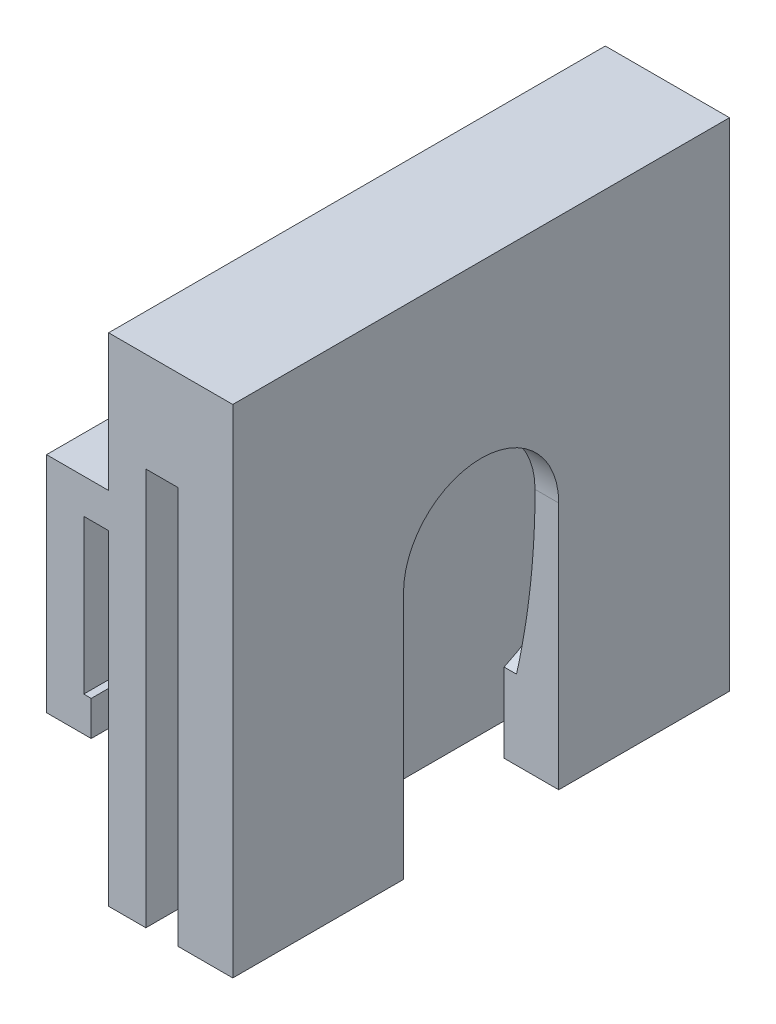
ISO-10303-21;
HEADER;
FILE_DESCRIPTION(('STEP AP214'),'2;1');
FILE_NAME('part.step','',(''),(''),'','','');
FILE_SCHEMA(('AUTOMOTIVE_DESIGN { 1 0 10303 214 1 1 1 1 }'));
ENDSEC;
DATA;
#1=APPLICATION_CONTEXT('core data for automotive mechanical design processes');
#2=APPLICATION_PROTOCOL_DEFINITION('international standard','automotive_design',2000,#1);
#3=PRODUCT_CONTEXT('',#1,'mechanical');
#4=PRODUCT('Part','Part','',(#3));
#5=PRODUCT_RELATED_PRODUCT_CATEGORY('part','',(#4));
#6=PRODUCT_DEFINITION_FORMATION('','',#4);
#7=PRODUCT_DEFINITION_CONTEXT('part definition',#1,'design');
#8=PRODUCT_DEFINITION('design','',#6,#7);
#9=PRODUCT_DEFINITION_SHAPE('','',#8);
#10=(LENGTH_UNIT() NAMED_UNIT(*) SI_UNIT(.MILLI.,.METRE.));
#11=(NAMED_UNIT(*) PLANE_ANGLE_UNIT() SI_UNIT($,.RADIAN.));
#12=(NAMED_UNIT(*) SI_UNIT($,.STERADIAN.) SOLID_ANGLE_UNIT());
#13=UNCERTAINTY_MEASURE_WITH_UNIT(LENGTH_MEASURE(1.E-05),#10,'distance_accuracy_value','');
#14=(GEOMETRIC_REPRESENTATION_CONTEXT(3) GLOBAL_UNCERTAINTY_ASSIGNED_CONTEXT((#13)) GLOBAL_UNIT_ASSIGNED_CONTEXT((#10,
#11,#12)) REPRESENTATION_CONTEXT('',''));
#15=CARTESIAN_POINT('',(0.,0.,0.));
#16=DIRECTION('',(0.,0.,1.));
#17=DIRECTION('',(1.,0.,0.));
#18=AXIS2_PLACEMENT_3D('',#15,#16,#17);
#19=CARTESIAN_POINT('',(-27.7842712474619,-10.,20.));
#20=DIRECTION('',(0.,-1.,0.));
#21=DIRECTION('',(0.,0.,-1.));
#22=AXIS2_PLACEMENT_3D('',#19,#20,#21);
#23=PLANE('',#22);
#24=DIRECTION('',(1.,0.,0.));
#25=VECTOR('',#24,1.);
#26=CARTESIAN_POINT('',(-13.6104853464801,-10.,6.875));
#27=LINE('',#26,#25);
#28=CARTESIAN_POINT('',(3.3,-10.,6.875));
#29=VERTEX_POINT('',#28);
#30=CARTESIAN_POINT('',(5.5,-10.,6.875));
#31=VERTEX_POINT('',#30);
#32=EDGE_CURVE('E274',#29,#31,#27,.T.);
#33=ORIENTED_EDGE('',*,*,#32,.F.);
#34=DIRECTION('',(0.,0.,1.));
#35=VECTOR('',#34,1.);
#36=CARTESIAN_POINT('',(3.3,-10.,0.));
#37=LINE('',#36,#35);
#38=CARTESIAN_POINT('',(3.3,-10.,0.));
#39=VERTEX_POINT('',#38);
#40=EDGE_CURVE('E236',#39,#29,#37,.T.);
#41=ORIENTED_EDGE('',*,*,#40,.F.);
#42=DIRECTION('',(1.,0.,0.));
#43=VECTOR('',#42,1.);
#44=CARTESIAN_POINT('',(-27.7842712474619,-10.,0.));
#45=LINE('',#44,#43);
#46=CARTESIAN_POINT('',(5.5,-10.,0.));
#47=VERTEX_POINT('',#46);
#48=EDGE_CURVE('E333',#39,#47,#45,.T.);
#49=ORIENTED_EDGE('',*,*,#48,.T.);
#50=DIRECTION('',(0.,0.,-1.));
#51=VECTOR('',#50,1.);
#52=CARTESIAN_POINT('',(5.5,-10.,20.));
#53=LINE('',#52,#51);
#54=EDGE_CURVE('E304',#31,#47,#53,.T.);
#55=ORIENTED_EDGE('',*,*,#54,.F.);
#56=EDGE_LOOP('',(#33,#41,#49,#55));
#57=FACE_BOUND('',#56,.T.);
#58=ADVANCED_FACE('F33',(#57),#23,.T.);
#59=DIRECTION('',(0.,0.,-1.));
#60=VECTOR('',#59,1.);
#61=CARTESIAN_POINT('',(2.,-10.,20.));
#62=LINE('',#61,#60);
#63=CARTESIAN_POINT('',(2.,-10.,20.));
#64=VERTEX_POINT('',#63);
#65=CARTESIAN_POINT('',(2.,-10.,0.));
#66=VERTEX_POINT('',#65);
#67=EDGE_CURVE('E273',#64,#66,#62,.T.);
#68=ORIENTED_EDGE('',*,*,#67,.F.);
#69=DIRECTION('',(1.,0.,0.));
#70=VECTOR('',#69,1.);
#71=CARTESIAN_POINT('',(-27.7842712474619,-10.,20.));
#72=LINE('',#71,#70);
#73=CARTESIAN_POINT('',(0.499999999999997,-10.,20.));
#74=VERTEX_POINT('',#73);
#75=EDGE_CURVE('E334',#74,#64,#72,.T.);
#76=ORIENTED_EDGE('',*,*,#75,.F.);
#77=DIRECTION('',(0.,0.,1.));
#78=VECTOR('',#77,1.);
#79=CARTESIAN_POINT('',(0.499999999999997,-10.,20.));
#80=LINE('',#79,#78);
#81=CARTESIAN_POINT('',(0.499999999999997,-10.,0.));
#82=VERTEX_POINT('',#81);
#83=EDGE_CURVE('E326',#82,#74,#80,.T.);
#84=ORIENTED_EDGE('',*,*,#83,.F.);
#85=EDGE_CURVE('E330',#82,#66,#45,.T.);
#86=ORIENTED_EDGE('',*,*,#85,.T.);
#87=EDGE_LOOP('',(#68,#76,#84,#86));
#88=FACE_BOUND('',#87,.T.);
#89=ADVANCED_FACE('F443',(#88),#23,.T.);
#90=CARTESIAN_POINT('',(2.,-4.5,20.));
#91=DIRECTION('',(0.,1.,0.));
#92=DIRECTION('',(-1.,0.,0.));
#93=AXIS2_PLACEMENT_3D('',#90,#91,#92);
#94=PLANE('',#93);
#95=DIRECTION('',(1.,0.,0.));
#96=VECTOR('',#95,1.);
#97=CARTESIAN_POINT('',(2.,-4.5,0.));
#98=LINE('',#97,#96);
#99=CARTESIAN_POINT('',(-2.,-4.5,0.));
#100=VERTEX_POINT('',#99);
#101=CARTESIAN_POINT('',(-0.2,-4.5,0.));
#102=VERTEX_POINT('',#101);
#103=EDGE_CURVE('E358',#100,#102,#98,.T.);
#104=ORIENTED_EDGE('',*,*,#103,.T.);
#105=DIRECTION('',(0.,0.,1.));
#106=VECTOR('',#105,1.);
#107=CARTESIAN_POINT('',(-0.2,-4.5,0.));
#108=LINE('',#107,#106);
#109=CARTESIAN_POINT('',(-0.2,-4.5,20.));
#110=VERTEX_POINT('',#109);
#111=EDGE_CURVE('E229',#102,#110,#108,.T.);
#112=ORIENTED_EDGE('',*,*,#111,.T.);
#113=DIRECTION('',(1.,0.,0.));
#114=VECTOR('',#113,1.);
#115=CARTESIAN_POINT('',(2.,-4.5,20.));
#116=LINE('',#115,#114);
#117=CARTESIAN_POINT('',(-2.,-4.5,20.));
#118=VERTEX_POINT('',#117);
#119=EDGE_CURVE('E349',#118,#110,#116,.T.);
#120=ORIENTED_EDGE('',*,*,#119,.F.);
#121=DIRECTION('',(0.,0.,-1.));
#122=VECTOR('',#121,1.);
#123=CARTESIAN_POINT('',(-2.,-4.5,20.));
#124=LINE('',#123,#122);
#125=EDGE_CURVE('E364',#118,#100,#124,.T.);
#126=ORIENTED_EDGE('',*,*,#125,.T.);
#127=EDGE_LOOP('',(#104,#112,#120,#126));
#128=FACE_BOUND('',#127,.T.);
#129=ADVANCED_FACE('F448',(#128),#94,.F.);
#130=CARTESIAN_POINT('',(2.,4.5,20.));
#131=DIRECTION('',(0.,-1.,0.));
#132=DIRECTION('',(1.,0.,0.));
#133=AXIS2_PLACEMENT_3D('',#130,#131,#132);
#134=PLANE('',#133);
#135=DIRECTION('',(0.,0.,1.));
#136=VECTOR('',#135,1.);
#137=CARTESIAN_POINT('',(0.500000000000001,4.5,20.));
#138=LINE('',#137,#136);
#139=CARTESIAN_POINT('',(0.5,4.5,0.));
#140=VERTEX_POINT('',#139);
#141=CARTESIAN_POINT('',(0.5,4.5,20.));
#142=VERTEX_POINT('',#141);
#143=EDGE_CURVE('E339',#140,#142,#138,.T.);
#144=ORIENTED_EDGE('',*,*,#143,.F.);
#145=DIRECTION('',(-1.,0.,0.));
#146=VECTOR('',#145,1.);
#147=CARTESIAN_POINT('',(2.,4.5,0.));
#148=LINE('',#147,#146);
#149=CARTESIAN_POINT('',(-2.,4.5,0.));
#150=VERTEX_POINT('',#149);
#151=EDGE_CURVE('E350',#140,#150,#148,.T.);
#152=ORIENTED_EDGE('',*,*,#151,.T.);
#153=DIRECTION('',(0.,0.,-1.));
#154=VECTOR('',#153,1.);
#155=CARTESIAN_POINT('',(-2.,4.5,20.));
#156=LINE('',#155,#154);
#157=CARTESIAN_POINT('',(-2.,4.5,20.));
#158=VERTEX_POINT('',#157);
#159=EDGE_CURVE('E355',#158,#150,#156,.T.);
#160=ORIENTED_EDGE('',*,*,#159,.F.);
#161=DIRECTION('',(-1.,0.,0.));
#162=VECTOR('',#161,1.);
#163=CARTESIAN_POINT('',(2.,4.5,20.));
#164=LINE('',#163,#162);
#165=EDGE_CURVE('E353',#142,#158,#164,.T.);
#166=ORIENTED_EDGE('',*,*,#165,.F.);
#167=EDGE_LOOP('',(#144,#152,#160,#166));
#168=FACE_BOUND('',#167,.T.);
#169=ADVANCED_FACE('F573',(#168),#134,.F.);
#170=CARTESIAN_POINT('',(-2.,4.5,20.));
#171=DIRECTION('',(1.,0.,0.));
#172=DIRECTION('',(0.,1.,0.));
#173=AXIS2_PLACEMENT_3D('',#170,#171,#172);
#174=PLANE('',#173);
#175=DIRECTION('',(0.,-1.,0.));
#176=VECTOR('',#175,1.);
#177=CARTESIAN_POINT('',(-2.,4.5,0.));
#178=LINE('',#177,#176);
#179=EDGE_CURVE('E344',#150,#100,#178,.T.);
#180=ORIENTED_EDGE('',*,*,#179,.T.);
#181=ORIENTED_EDGE('',*,*,#125,.F.);
#182=DIRECTION('',(0.,-1.,0.));
#183=VECTOR('',#182,1.);
#184=CARTESIAN_POINT('',(-2.,4.5,20.));
#185=LINE('',#184,#183);
#186=EDGE_CURVE('E346',#158,#118,#185,.T.);
#187=ORIENTED_EDGE('',*,*,#186,.F.);
#188=ORIENTED_EDGE('',*,*,#159,.T.);
#189=EDGE_LOOP('',(#180,#181,#187,#188));
#190=FACE_BOUND('',#189,.T.);
#191=ADVANCED_FACE('F35',(#190),#174,.F.);
#192=CARTESIAN_POINT('',(0.,0.,20.));
#193=DIRECTION('',(0.,0.,-1.));
#194=DIRECTION('',(-1.,0.,0.));
#195=AXIS2_PLACEMENT_3D('',#192,#193,#194);
#196=PLANE('',#195);
#197=DIRECTION('',(0.,1.,0.));
#198=VECTOR('',#197,1.);
#199=CARTESIAN_POINT('',(-0.499999999999999,3.,20.));
#200=LINE('',#199,#198);
#201=CARTESIAN_POINT('',(-0.5,-3.1,20.));
#202=VERTEX_POINT('',#201);
#203=CARTESIAN_POINT('',(-0.5,3.1,20.));
#204=VERTEX_POINT('',#203);
#205=EDGE_CURVE('E211',#202,#204,#200,.T.);
#206=ORIENTED_EDGE('',*,*,#205,.T.);
#207=DIRECTION('',(-1.,0.,0.));
#208=VECTOR('',#207,1.);
#209=CARTESIAN_POINT('',(-0.5,3.1,20.));
#210=LINE('',#209,#208);
#211=CARTESIAN_POINT('',(0.500000000000001,3.1,20.));
#212=VERTEX_POINT('',#211);
#213=EDGE_CURVE('E215',#212,#204,#210,.T.);
#214=ORIENTED_EDGE('',*,*,#213,.F.);
#215=DIRECTION('',(0.,-1.,0.));
#216=VECTOR('',#215,1.);
#217=CARTESIAN_POINT('',(0.500000000000001,3.,20.));
#218=LINE('',#217,#216);
#219=EDGE_CURVE('E206',#212,#74,#218,.T.);
#220=ORIENTED_EDGE('',*,*,#219,.T.);
#221=ORIENTED_EDGE('',*,*,#75,.T.);
#222=DIRECTION('',(0.,-1.,0.));
#223=VECTOR('',#222,1.);
#224=CARTESIAN_POINT('',(2.,6.,20.));
#225=LINE('',#224,#223);
#226=CARTESIAN_POINT('',(2.,6.,20.));
#227=VERTEX_POINT('',#226);
#228=EDGE_CURVE('E291',#227,#64,#225,.T.);
#229=ORIENTED_EDGE('',*,*,#228,.F.);
#230=DIRECTION('',(-1.,0.,0.));
#231=VECTOR('',#230,1.);
#232=CARTESIAN_POINT('',(2.,6.,20.));
#233=LINE('',#232,#231);
#234=CARTESIAN_POINT('',(3.3,6.,20.));
#235=VERTEX_POINT('',#234);
#236=EDGE_CURVE('E287',#235,#227,#233,.T.);
#237=ORIENTED_EDGE('',*,*,#236,.F.);
#238=DIRECTION('',(0.,1.,0.));
#239=VECTOR('',#238,1.);
#240=CARTESIAN_POINT('',(3.3,-10.,20.));
#241=LINE('',#240,#239);
#242=CARTESIAN_POINT('',(3.3,-10.,20.));
#243=VERTEX_POINT('',#242);
#244=EDGE_CURVE('E256',#243,#235,#241,.T.);
#245=ORIENTED_EDGE('',*,*,#244,.F.);
#246=CARTESIAN_POINT('',(5.5,-10.,20.));
#247=VERTEX_POINT('',#246);
#248=EDGE_CURVE('E317',#243,#247,#72,.T.);
#249=ORIENTED_EDGE('',*,*,#248,.T.);
#250=DIRECTION('',(0.,-1.,0.));
#251=VECTOR('',#250,1.);
#252=CARTESIAN_POINT('',(5.5,10.,20.));
#253=LINE('',#252,#251);
#254=CARTESIAN_POINT('',(5.5,10.,20.));
#255=VERTEX_POINT('',#254);
#256=EDGE_CURVE('E314',#255,#247,#253,.T.);
#257=ORIENTED_EDGE('',*,*,#256,.F.);
#258=DIRECTION('',(1.,0.,0.));
#259=VECTOR('',#258,1.);
#260=CARTESIAN_POINT('',(-27.7842712474619,10.,20.));
#261=LINE('',#260,#259);
#262=CARTESIAN_POINT('',(0.5,10.,20.));
#263=VERTEX_POINT('',#262);
#264=EDGE_CURVE('E322',#263,#255,#261,.T.);
#265=ORIENTED_EDGE('',*,*,#264,.F.);
#266=DIRECTION('',(0.,1.,0.));
#267=VECTOR('',#266,1.);
#268=CARTESIAN_POINT('',(0.5,9.99999999999999,20.));
#269=LINE('',#268,#267);
#270=EDGE_CURVE('E324',#142,#263,#269,.T.);
#271=ORIENTED_EDGE('',*,*,#270,.F.);
#272=ORIENTED_EDGE('',*,*,#165,.T.);
#273=ORIENTED_EDGE('',*,*,#186,.T.);
#274=ORIENTED_EDGE('',*,*,#119,.T.);
#275=DIRECTION('',(0.,-1.,0.));
#276=VECTOR('',#275,1.);
#277=CARTESIAN_POINT('',(-0.2,-4.5,20.));
#278=LINE('',#277,#276);
#279=CARTESIAN_POINT('',(-0.2,-3.1,20.));
#280=VERTEX_POINT('',#279);
#281=EDGE_CURVE('E224',#280,#110,#278,.T.);
#282=ORIENTED_EDGE('',*,*,#281,.F.);
#283=DIRECTION('',(1.,0.,0.));
#284=VECTOR('',#283,1.);
#285=CARTESIAN_POINT('',(-0.5,-3.1,20.));
#286=LINE('',#285,#284);
#287=EDGE_CURVE('E48',#202,#280,#286,.T.);
#288=ORIENTED_EDGE('',*,*,#287,.F.);
#289=EDGE_LOOP('',(#206,#214,#220,#221,#229,#237,#245,#249,#257,#265,#271,#272,#273,#274,#282,#288));
#290=FACE_BOUND('',#289,.T.);
#291=ADVANCED_FACE('F414',(#290),#196,.F.);
#292=CARTESIAN_POINT('',(0.,0.,0.));
#293=DIRECTION('',(0.,0.,-1.));
#294=DIRECTION('',(-1.,0.,0.));
#295=AXIS2_PLACEMENT_3D('',#292,#293,#294);
#296=PLANE('',#295);
#297=DIRECTION('',(-1.,0.,0.));
#298=VECTOR('',#297,1.);
#299=CARTESIAN_POINT('',(-0.5,3.1,0.));
#300=LINE('',#299,#298);
#301=CARTESIAN_POINT('',(0.500000000000001,3.1,0.));
#302=VERTEX_POINT('',#301);
#303=CARTESIAN_POINT('',(-0.5,3.1,0.));
#304=VERTEX_POINT('',#303);
#305=EDGE_CURVE('E202',#302,#304,#300,.T.);
#306=ORIENTED_EDGE('',*,*,#305,.T.);
#307=DIRECTION('',(0.,1.,0.));
#308=VECTOR('',#307,1.);
#309=CARTESIAN_POINT('',(-0.499999999999999,3.,0.));
#310=LINE('',#309,#308);
#311=CARTESIAN_POINT('',(-0.5,-3.1,0.));
#312=VERTEX_POINT('',#311);
#313=EDGE_CURVE('E195',#312,#304,#310,.T.);
#314=ORIENTED_EDGE('',*,*,#313,.F.);
#315=DIRECTION('',(1.,0.,0.));
#316=VECTOR('',#315,1.);
#317=CARTESIAN_POINT('',(-0.5,-3.1,0.));
#318=LINE('',#317,#316);
#319=CARTESIAN_POINT('',(-0.2,-3.1,0.));
#320=VERTEX_POINT('',#319);
#321=EDGE_CURVE('E199',#312,#320,#318,.T.);
#322=ORIENTED_EDGE('',*,*,#321,.T.);
#323=DIRECTION('',(0.,-1.,0.));
#324=VECTOR('',#323,1.);
#325=CARTESIAN_POINT('',(-0.2,-4.5,0.));
#326=LINE('',#325,#324);
#327=EDGE_CURVE('E227',#320,#102,#326,.T.);
#328=ORIENTED_EDGE('',*,*,#327,.T.);
#329=ORIENTED_EDGE('',*,*,#103,.F.);
#330=ORIENTED_EDGE('',*,*,#179,.F.);
#331=ORIENTED_EDGE('',*,*,#151,.F.);
#332=DIRECTION('',(0.,-1.,0.));
#333=VECTOR('',#332,1.);
#334=CARTESIAN_POINT('',(0.5,9.99999999999999,0.));
#335=LINE('',#334,#333);
#336=CARTESIAN_POINT('',(0.5,10.,0.));
#337=VERTEX_POINT('',#336);
#338=EDGE_CURVE('E318',#337,#140,#335,.T.);
#339=ORIENTED_EDGE('',*,*,#338,.F.);
#340=DIRECTION('',(1.,0.,0.));
#341=VECTOR('',#340,1.);
#342=CARTESIAN_POINT('',(-27.7842712474619,10.,0.));
#343=LINE('',#342,#341);
#344=CARTESIAN_POINT('',(5.5,10.,0.));
#345=VERTEX_POINT('',#344);
#346=EDGE_CURVE('E328',#337,#345,#343,.T.);
#347=ORIENTED_EDGE('',*,*,#346,.T.);
#348=DIRECTION('',(0.,1.,0.));
#349=VECTOR('',#348,1.);
#350=CARTESIAN_POINT('',(5.5,-10.,0.));
#351=LINE('',#350,#349);
#352=EDGE_CURVE('E308',#47,#345,#351,.T.);
#353=ORIENTED_EDGE('',*,*,#352,.F.);
#354=ORIENTED_EDGE('',*,*,#48,.F.);
#355=DIRECTION('',(0.,-1.,0.));
#356=VECTOR('',#355,1.);
#357=CARTESIAN_POINT('',(3.3,6.,0.));
#358=LINE('',#357,#356);
#359=CARTESIAN_POINT('',(3.3,6.,0.));
#360=VERTEX_POINT('',#359);
#361=EDGE_CURVE('E233',#360,#39,#358,.T.);
#362=ORIENTED_EDGE('',*,*,#361,.F.);
#363=DIRECTION('',(1.,0.,0.));
#364=VECTOR('',#363,1.);
#365=CARTESIAN_POINT('',(2.,6.,0.));
#366=LINE('',#365,#364);
#367=CARTESIAN_POINT('',(2.,6.,0.));
#368=VERTEX_POINT('',#367);
#369=EDGE_CURVE('E283',#368,#360,#366,.T.);
#370=ORIENTED_EDGE('',*,*,#369,.F.);
#371=DIRECTION('',(0.,-1.,0.));
#372=VECTOR('',#371,1.);
#373=CARTESIAN_POINT('',(2.,6.,0.));
#374=LINE('',#373,#372);
#375=EDGE_CURVE('E289',#368,#66,#374,.T.);
#376=ORIENTED_EDGE('',*,*,#375,.T.);
#377=ORIENTED_EDGE('',*,*,#85,.F.);
#378=DIRECTION('',(0.,-1.,0.));
#379=VECTOR('',#378,1.);
#380=CARTESIAN_POINT('',(0.500000000000001,3.,0.));
#381=LINE('',#380,#379);
#382=EDGE_CURVE('E207',#302,#82,#381,.T.);
#383=ORIENTED_EDGE('',*,*,#382,.F.);
#384=EDGE_LOOP('',(#306,#314,#322,#328,#329,#330,#331,#339,#347,#353,#354,#362,#370,#376,#377,#383));
#385=FACE_BOUND('',#384,.T.);
#386=ADVANCED_FACE('F197',(#385),#296,.T.);
#387=CARTESIAN_POINT('',(0.500000000000001,3.,20.));
#388=DIRECTION('',(1.,0.,0.));
#389=DIRECTION('',(0.,1.,0.));
#390=AXIS2_PLACEMENT_3D('',#387,#388,#389);
#391=PLANE('',#390);
#392=ORIENTED_EDGE('',*,*,#83,.T.);
#393=ORIENTED_EDGE('',*,*,#219,.F.);
#394=DIRECTION('',(0.,0.,1.));
#395=VECTOR('',#394,1.);
#396=CARTESIAN_POINT('',(0.500000000000001,3.1,0.));
#397=LINE('',#396,#395);
#398=EDGE_CURVE('E212',#302,#212,#397,.T.);
#399=ORIENTED_EDGE('',*,*,#398,.F.);
#400=ORIENTED_EDGE('',*,*,#382,.T.);
#401=EDGE_LOOP('',(#392,#393,#399,#400));
#402=FACE_BOUND('',#401,.T.);
#403=ADVANCED_FACE('F461',(#402),#391,.F.);
#404=CARTESIAN_POINT('',(-0.499999999999999,3.,20.));
#405=DIRECTION('',(-1.,0.,0.));
#406=DIRECTION('',(0.,-1.,0.));
#407=AXIS2_PLACEMENT_3D('',#404,#405,#406);
#408=PLANE('',#407);
#409=ORIENTED_EDGE('',*,*,#313,.T.);
#410=DIRECTION('',(0.,0.,1.));
#411=VECTOR('',#410,1.);
#412=CARTESIAN_POINT('',(-0.5,3.1,0.));
#413=LINE('',#412,#411);
#414=EDGE_CURVE('E222',#304,#204,#413,.T.);
#415=ORIENTED_EDGE('',*,*,#414,.T.);
#416=ORIENTED_EDGE('',*,*,#205,.F.);
#417=DIRECTION('',(0.,0.,1.));
#418=VECTOR('',#417,1.);
#419=CARTESIAN_POINT('',(-0.5,-3.1,0.));
#420=LINE('',#419,#418);
#421=EDGE_CURVE('E209',#312,#202,#420,.T.);
#422=ORIENTED_EDGE('',*,*,#421,.F.);
#423=EDGE_LOOP('',(#409,#415,#416,#422));
#424=FACE_BOUND('',#423,.T.);
#425=ADVANCED_FACE('F210',(#424),#408,.F.);
#426=CARTESIAN_POINT('',(-27.7842712474619,10.,20.));
#427=DIRECTION('',(0.,1.,0.));
#428=DIRECTION('',(0.,0.,1.));
#429=AXIS2_PLACEMENT_3D('',#426,#427,#428);
#430=PLANE('',#429);
#431=DIRECTION('',(0.,0.,-1.));
#432=VECTOR('',#431,1.);
#433=CARTESIAN_POINT('',(0.5,10.,20.));
#434=LINE('',#433,#432);
#435=EDGE_CURVE('E321',#263,#337,#434,.T.);
#436=ORIENTED_EDGE('',*,*,#435,.F.);
#437=ORIENTED_EDGE('',*,*,#264,.T.);
#438=DIRECTION('',(0.,0.,1.));
#439=VECTOR('',#438,1.);
#440=CARTESIAN_POINT('',(5.5,10.,0.));
#441=LINE('',#440,#439);
#442=EDGE_CURVE('E311',#345,#255,#441,.T.);
#443=ORIENTED_EDGE('',*,*,#442,.F.);
#444=ORIENTED_EDGE('',*,*,#346,.F.);
#445=EDGE_LOOP('',(#436,#437,#443,#444));
#446=FACE_BOUND('',#445,.T.);
#447=ADVANCED_FACE('F410',(#446),#430,.T.);
#448=ORIENTED_EDGE('',*,*,#338,.T.);
#449=ORIENTED_EDGE('',*,*,#143,.T.);
#450=ORIENTED_EDGE('',*,*,#270,.T.);
#451=ORIENTED_EDGE('',*,*,#435,.T.);
#452=EDGE_LOOP('',(#448,#449,#450,#451));
#453=FACE_BOUND('',#452,.T.);
#454=ADVANCED_FACE('F453',(#453),#391,.F.);
#455=DIRECTION('',(1.,0.,0.));
#456=VECTOR('',#455,1.);
#457=CARTESIAN_POINT('',(-13.6104853464801,-10.,13.125));
#458=LINE('',#457,#456);
#459=CARTESIAN_POINT('',(3.3,-10.,13.125));
#460=VERTEX_POINT('',#459);
#461=CARTESIAN_POINT('',(5.5,-10.,13.125));
#462=VERTEX_POINT('',#461);
#463=EDGE_CURVE('E276',#460,#462,#458,.T.);
#464=ORIENTED_EDGE('',*,*,#463,.T.);
#465=EDGE_CURVE('E305',#247,#462,#53,.T.);
#466=ORIENTED_EDGE('',*,*,#465,.F.);
#467=ORIENTED_EDGE('',*,*,#248,.F.);
#468=DIRECTION('',(0.,0.,1.));
#469=VECTOR('',#468,1.);
#470=CARTESIAN_POINT('',(3.3,-10.,13.125));
#471=LINE('',#470,#469);
#472=EDGE_CURVE('E253',#460,#243,#471,.T.);
#473=ORIENTED_EDGE('',*,*,#472,.F.);
#474=EDGE_LOOP('',(#464,#466,#467,#473));
#475=FACE_BOUND('',#474,.T.);
#476=ADVANCED_FACE('F418',(#475),#23,.T.);
#477=CARTESIAN_POINT('',(5.5,0.,0.));
#478=DIRECTION('',(1.,0.,0.));
#479=DIRECTION('',(0.,0.,-1.));
#480=AXIS2_PLACEMENT_3D('',#477,#478,#479);
#481=PLANE('',#480);
#482=DIRECTION('',(0.,1.,0.));
#483=VECTOR('',#482,1.);
#484=CARTESIAN_POINT('',(5.5,0.,6.875));
#485=LINE('',#484,#483);
#486=CARTESIAN_POINT('',(5.5,0.,6.875));
#487=VERTEX_POINT('',#486);
#488=EDGE_CURVE('E267',#31,#487,#485,.T.);
#489=ORIENTED_EDGE('',*,*,#488,.F.);
#490=ORIENTED_EDGE('',*,*,#54,.T.);
#491=ORIENTED_EDGE('',*,*,#352,.T.);
#492=ORIENTED_EDGE('',*,*,#442,.T.);
#493=ORIENTED_EDGE('',*,*,#256,.T.);
#494=ORIENTED_EDGE('',*,*,#465,.T.);
#495=DIRECTION('',(0.,-1.,0.));
#496=VECTOR('',#495,1.);
#497=CARTESIAN_POINT('',(5.5,0.,13.125));
#498=LINE('',#497,#496);
#499=CARTESIAN_POINT('',(5.5,0.,13.125));
#500=VERTEX_POINT('',#499);
#501=EDGE_CURVE('E265',#500,#462,#498,.T.);
#502=ORIENTED_EDGE('',*,*,#501,.F.);
#503=CARTESIAN_POINT('',(5.5,0.,10.));
#504=DIRECTION('',(1.,0.,0.));
#505=DIRECTION('',(0.,0.,-1.));
#506=AXIS2_PLACEMENT_3D('',#503,#504,#505);
#507=CIRCLE('',#506,3.125);
#508=EDGE_CURVE('E262',#487,#500,#507,.T.);
#509=ORIENTED_EDGE('',*,*,#508,.F.);
#510=EDGE_LOOP('',(#489,#490,#491,#492,#493,#494,#502,#509));
#511=FACE_BOUND('',#510,.T.);
#512=ADVANCED_FACE('F402',(#511),#481,.T.);
#513=CARTESIAN_POINT('',(0.,6.,0.));
#514=DIRECTION('',(0.,-1.,0.));
#515=DIRECTION('',(0.,0.,-1.));
#516=AXIS2_PLACEMENT_3D('',#513,#514,#515);
#517=PLANE('',#516);
#518=DIRECTION('',(0.,0.,-1.));
#519=VECTOR('',#518,1.);
#520=CARTESIAN_POINT('',(3.3,6.,5.50000000000004));
#521=LINE('',#520,#519);
#522=CARTESIAN_POINT('',(3.3,6.,5.50000000000004));
#523=VERTEX_POINT('',#522);
#524=EDGE_CURVE('E243',#523,#360,#521,.T.);
#525=ORIENTED_EDGE('',*,*,#524,.F.);
#526=DIRECTION('',(1.,0.,0.));
#527=VECTOR('',#526,1.);
#528=CARTESIAN_POINT('',(88.99,6.,5.5));
#529=LINE('',#528,#527);
#530=CARTESIAN_POINT('',(2.,6.,5.5));
#531=VERTEX_POINT('',#530);
#532=EDGE_CURVE('E297',#531,#523,#529,.T.);
#533=ORIENTED_EDGE('',*,*,#532,.F.);
#534=DIRECTION('',(0.,0.,-1.));
#535=VECTOR('',#534,1.);
#536=CARTESIAN_POINT('',(2.,6.,20.));
#537=LINE('',#536,#535);
#538=EDGE_CURVE('E284',#531,#368,#537,.T.);
#539=ORIENTED_EDGE('',*,*,#538,.T.);
#540=ORIENTED_EDGE('',*,*,#369,.T.);
#541=EDGE_LOOP('',(#525,#533,#539,#540));
#542=FACE_BOUND('',#541,.T.);
#543=ADVANCED_FACE('F389',(#542),#517,.T.);
#544=DIRECTION('',(0.,0.,-1.));
#545=VECTOR('',#544,1.);
#546=CARTESIAN_POINT('',(3.3,6.,20.));
#547=LINE('',#546,#545);
#548=CARTESIAN_POINT('',(3.3,6.,14.5));
#549=VERTEX_POINT('',#548);
#550=EDGE_CURVE('E258',#235,#549,#547,.T.);
#551=ORIENTED_EDGE('',*,*,#550,.F.);
#552=ORIENTED_EDGE('',*,*,#236,.T.);
#553=CARTESIAN_POINT('',(2.,6.,14.5));
#554=VERTEX_POINT('',#553);
#555=EDGE_CURVE('E280',#227,#554,#537,.T.);
#556=ORIENTED_EDGE('',*,*,#555,.T.);
#557=DIRECTION('',(1.,0.,0.));
#558=VECTOR('',#557,1.);
#559=CARTESIAN_POINT('',(88.99,6.,14.5));
#560=LINE('',#559,#558);
#561=EDGE_CURVE('E293',#549,#554,#560,.F.);
#562=ORIENTED_EDGE('',*,*,#561,.F.);
#563=EDGE_LOOP('',(#551,#552,#556,#562));
#564=FACE_BOUND('',#563,.T.);
#565=ADVANCED_FACE('F634',(#564),#517,.T.);
#566=CARTESIAN_POINT('',(88.99,0.,10.));
#567=DIRECTION('',(1.,0.,0.));
#568=DIRECTION('',(0.,0.,-1.));
#569=AXIS2_PLACEMENT_3D('',#566,#567,#568);
#570=CYLINDRICAL_SURFACE('',#569,7.5);
#571=CARTESIAN_POINT('',(2.,0.,10.));
#572=DIRECTION('',(1.,0.,0.));
#573=DIRECTION('',(0.,0.,-1.));
#574=AXIS2_PLACEMENT_3D('',#571,#572,#573);
#575=CIRCLE('',#574,7.5);
#576=EDGE_CURVE('E300',#531,#554,#575,.T.);
#577=ORIENTED_EDGE('',*,*,#576,.F.);
#578=ORIENTED_EDGE('',*,*,#532,.T.);
#579=CARTESIAN_POINT('',(3.3,0.,10.));
#580=DIRECTION('',(1.,0.,0.));
#581=DIRECTION('',(0.,0.,1.));
#582=AXIS2_PLACEMENT_3D('',#579,#580,#581);
#583=CIRCLE('',#582,7.49999999999997);
#584=CARTESIAN_POINT('',(3.3,-6.81794507164729,6.875));
#585=VERTEX_POINT('',#584);
#586=EDGE_CURVE('E241',#585,#523,#583,.T.);
#587=ORIENTED_EDGE('',*,*,#586,.F.);
#588=DIRECTION('',(1.,0.,0.));
#589=VECTOR('',#588,1.);
#590=CARTESIAN_POINT('',(3.3,-6.81794507164729,6.875));
#591=LINE('',#590,#589);
#592=CARTESIAN_POINT('',(3.8,-6.81794507164729,6.875));
#593=VERTEX_POINT('',#592);
#594=EDGE_CURVE('E245',#585,#593,#591,.T.);
#595=ORIENTED_EDGE('',*,*,#594,.T.);
#596=CARTESIAN_POINT('',(3.8,0.,10.));
#597=DIRECTION('',(1.,0.,0.));
#598=DIRECTION('',(0.,0.,-1.));
#599=AXIS2_PLACEMENT_3D('',#596,#597,#598);
#600=CIRCLE('',#599,7.50000000000001);
#601=CARTESIAN_POINT('',(3.8,-6.81794507164733,13.125));
#602=VERTEX_POINT('',#601);
#603=EDGE_CURVE('E55',#593,#602,#600,.T.);
#604=ORIENTED_EDGE('',*,*,#603,.T.);
#605=DIRECTION('',(1.,0.,0.));
#606=VECTOR('',#605,1.);
#607=CARTESIAN_POINT('',(3.3,-6.81794507164732,13.125));
#608=LINE('',#607,#606);
#609=CARTESIAN_POINT('',(3.3,-6.81794507164732,13.125));
#610=VERTEX_POINT('',#609);
#611=EDGE_CURVE('E260',#610,#602,#608,.T.);
#612=ORIENTED_EDGE('',*,*,#611,.F.);
#613=CARTESIAN_POINT('',(3.3,0.,10.));
#614=DIRECTION('',(1.,0.,0.));
#615=DIRECTION('',(0.,0.,1.));
#616=AXIS2_PLACEMENT_3D('',#613,#614,#615);
#617=CIRCLE('',#616,7.5);
#618=EDGE_CURVE('E247',#549,#610,#617,.T.);
#619=ORIENTED_EDGE('',*,*,#618,.F.);
#620=ORIENTED_EDGE('',*,*,#561,.T.);
#621=EDGE_LOOP('',(#577,#578,#587,#595,#604,#612,#619,#620));
#622=FACE_BOUND('',#621,.T.);
#623=ADVANCED_FACE('F383',(#622),#570,.F.);
#624=CARTESIAN_POINT('',(-26.99,0.,10.));
#625=DIRECTION('',(1.,0.,0.));
#626=DIRECTION('',(0.,1.,0.));
#627=AXIS2_PLACEMENT_3D('',#624,#625,#626);
#628=SPHERICAL_SURFACE('',#627,31.6902839999896);
#629=CARTESIAN_POINT('',(-26.99,0.,6.875));
#630=DIRECTION('',(0.,0.,-1.));
#631=DIRECTION('',(-1.,0.,0.));
#632=AXIS2_PLACEMENT_3D('',#629,#630,#631);
#633=CIRCLE('',#632,31.5358284337038);
#634=CARTESIAN_POINT('',(4.54582843370378,0.,6.875));
#635=VERTEX_POINT('',#634);
#636=EDGE_CURVE('E41',#635,#593,#633,.T.);
#637=ORIENTED_EDGE('',*,*,#636,.F.);
#638=CARTESIAN_POINT('',(4.54582843370378,0.,10.));
#639=DIRECTION('',(-1.,0.,0.));
#640=DIRECTION('',(0.,0.,1.));
#641=AXIS2_PLACEMENT_3D('',#638,#639,#640);
#642=CIRCLE('',#641,3.125);
#643=CARTESIAN_POINT('',(4.54582843370378,0.,13.125));
#644=VERTEX_POINT('',#643);
#645=EDGE_CURVE('E369',#644,#635,#642,.T.);
#646=ORIENTED_EDGE('',*,*,#645,.F.);
#647=CARTESIAN_POINT('',(-26.99,0.,13.125));
#648=DIRECTION('',(0.,0.,1.));
#649=DIRECTION('',(0.,-1.,0.));
#650=AXIS2_PLACEMENT_3D('',#647,#648,#649);
#651=CIRCLE('',#650,31.5358284337038);
#652=EDGE_CURVE('E367',#602,#644,#651,.T.);
#653=ORIENTED_EDGE('',*,*,#652,.F.);
#654=ORIENTED_EDGE('',*,*,#603,.F.);
#655=EDGE_LOOP('',(#637,#646,#653,#654));
#656=FACE_BOUND('',#655,.T.);
#657=ADVANCED_FACE('F380',(#656),#628,.F.);
#658=CARTESIAN_POINT('',(2.,7.5,10.));
#659=DIRECTION('',(1.,0.,0.));
#660=DIRECTION('',(0.,0.,-1.));
#661=AXIS2_PLACEMENT_3D('',#658,#659,#660);
#662=PLANE('',#661);
#663=ORIENTED_EDGE('',*,*,#576,.T.);
#664=ORIENTED_EDGE('',*,*,#555,.F.);
#665=ORIENTED_EDGE('',*,*,#228,.T.);
#666=ORIENTED_EDGE('',*,*,#67,.T.);
#667=ORIENTED_EDGE('',*,*,#375,.F.);
#668=ORIENTED_EDGE('',*,*,#538,.F.);
#669=EDGE_LOOP('',(#663,#664,#665,#666,#667,#668));
#670=FACE_BOUND('',#669,.T.);
#671=ADVANCED_FACE('F431',(#670),#662,.T.);
#672=CARTESIAN_POINT('',(-13.6104853464801,0.,10.));
#673=DIRECTION('',(1.,0.,0.));
#674=DIRECTION('',(0.,0.,-1.));
#675=AXIS2_PLACEMENT_3D('',#672,#673,#674);
#676=CYLINDRICAL_SURFACE('',#675,3.125);
#677=ORIENTED_EDGE('',*,*,#645,.T.);
#678=DIRECTION('',(1.,0.,0.));
#679=VECTOR('',#678,1.);
#680=CARTESIAN_POINT('',(-13.6104853464801,0.,6.875));
#681=LINE('',#680,#679);
#682=EDGE_CURVE('E271',#635,#487,#681,.T.);
#683=ORIENTED_EDGE('',*,*,#682,.T.);
#684=ORIENTED_EDGE('',*,*,#508,.T.);
#685=DIRECTION('',(1.,0.,0.));
#686=VECTOR('',#685,1.);
#687=CARTESIAN_POINT('',(-13.6104853464801,0.,13.125));
#688=LINE('',#687,#686);
#689=EDGE_CURVE('E270',#644,#500,#688,.T.);
#690=ORIENTED_EDGE('',*,*,#689,.F.);
#691=EDGE_LOOP('',(#677,#683,#684,#690));
#692=FACE_BOUND('',#691,.T.);
#693=ADVANCED_FACE('F429',(#692),#676,.F.);
#694=CARTESIAN_POINT('',(-13.6104853464801,0.,6.875));
#695=DIRECTION('',(0.,0.,-1.));
#696=DIRECTION('',(-1.,0.,0.));
#697=AXIS2_PLACEMENT_3D('',#694,#695,#696);
#698=PLANE('',#697);
#699=ORIENTED_EDGE('',*,*,#636,.T.);
#700=ORIENTED_EDGE('',*,*,#594,.F.);
#701=DIRECTION('',(0.,1.,0.));
#702=VECTOR('',#701,1.);
#703=CARTESIAN_POINT('',(3.3,-10.,6.875));
#704=LINE('',#703,#702);
#705=EDGE_CURVE('E239',#29,#585,#704,.T.);
#706=ORIENTED_EDGE('',*,*,#705,.F.);
#707=ORIENTED_EDGE('',*,*,#32,.T.);
#708=ORIENTED_EDGE('',*,*,#488,.T.);
#709=ORIENTED_EDGE('',*,*,#682,.F.);
#710=EDGE_LOOP('',(#699,#700,#706,#707,#708,#709));
#711=FACE_BOUND('',#710,.T.);
#712=ADVANCED_FACE('F375',(#711),#698,.F.);
#713=CARTESIAN_POINT('',(-13.6104853464801,0.,13.125));
#714=DIRECTION('',(0.,0.,1.));
#715=DIRECTION('',(0.,-1.,0.));
#716=AXIS2_PLACEMENT_3D('',#713,#714,#715);
#717=PLANE('',#716);
#718=ORIENTED_EDGE('',*,*,#652,.T.);
#719=ORIENTED_EDGE('',*,*,#689,.T.);
#720=ORIENTED_EDGE('',*,*,#501,.T.);
#721=ORIENTED_EDGE('',*,*,#463,.F.);
#722=DIRECTION('',(0.,-1.,0.));
#723=VECTOR('',#722,1.);
#724=CARTESIAN_POINT('',(3.3,-6.81794507164732,13.125));
#725=LINE('',#724,#723);
#726=EDGE_CURVE('E250',#610,#460,#725,.T.);
#727=ORIENTED_EDGE('',*,*,#726,.F.);
#728=ORIENTED_EDGE('',*,*,#611,.T.);
#729=EDGE_LOOP('',(#718,#719,#720,#721,#727,#728));
#730=FACE_BOUND('',#729,.T.);
#731=ADVANCED_FACE('F421',(#730),#717,.F.);
#732=CARTESIAN_POINT('',(3.3,0.,10.));
#733=DIRECTION('',(-1.,0.,0.));
#734=DIRECTION('',(0.,0.,1.));
#735=AXIS2_PLACEMENT_3D('',#732,#733,#734);
#736=PLANE('',#735);
#737=ORIENTED_EDGE('',*,*,#618,.T.);
#738=ORIENTED_EDGE('',*,*,#726,.T.);
#739=ORIENTED_EDGE('',*,*,#472,.T.);
#740=ORIENTED_EDGE('',*,*,#244,.T.);
#741=ORIENTED_EDGE('',*,*,#550,.T.);
#742=EDGE_LOOP('',(#737,#738,#739,#740,#741));
#743=FACE_BOUND('',#742,.T.);
#744=ADVANCED_FACE('F423',(#743),#736,.T.);
#745=CARTESIAN_POINT('',(3.3,0.,10.));
#746=DIRECTION('',(-1.,0.,0.));
#747=DIRECTION('',(0.,0.,1.));
#748=AXIS2_PLACEMENT_3D('',#745,#746,#747);
#749=PLANE('',#748);
#750=ORIENTED_EDGE('',*,*,#361,.T.);
#751=ORIENTED_EDGE('',*,*,#40,.T.);
#752=ORIENTED_EDGE('',*,*,#705,.T.);
#753=ORIENTED_EDGE('',*,*,#586,.T.);
#754=ORIENTED_EDGE('',*,*,#524,.T.);
#755=EDGE_LOOP('',(#750,#751,#752,#753,#754));
#756=FACE_BOUND('',#755,.T.);
#757=ADVANCED_FACE('F386',(#756),#749,.T.);
#758=CARTESIAN_POINT('',(-0.2,-4.5,0.));
#759=DIRECTION('',(-1.,0.,0.));
#760=DIRECTION('',(0.,0.,1.));
#761=AXIS2_PLACEMENT_3D('',#758,#759,#760);
#762=PLANE('',#761);
#763=ORIENTED_EDGE('',*,*,#327,.F.);
#764=DIRECTION('',(0.,0.,1.));
#765=VECTOR('',#764,1.);
#766=CARTESIAN_POINT('',(-0.2,-3.1,0.));
#767=LINE('',#766,#765);
#768=EDGE_CURVE('E11',#320,#280,#767,.T.);
#769=ORIENTED_EDGE('',*,*,#768,.T.);
#770=ORIENTED_EDGE('',*,*,#281,.T.);
#771=ORIENTED_EDGE('',*,*,#111,.F.);
#772=EDGE_LOOP('',(#763,#769,#770,#771));
#773=FACE_BOUND('',#772,.T.);
#774=ADVANCED_FACE('F487',(#773),#762,.F.);
#775=CARTESIAN_POINT('',(-0.5,-3.1,0.));
#776=DIRECTION('',(0.,-1.,0.));
#777=DIRECTION('',(0.,0.,-1.));
#778=AXIS2_PLACEMENT_3D('',#775,#776,#777);
#779=PLANE('',#778);
#780=ORIENTED_EDGE('',*,*,#321,.F.);
#781=ORIENTED_EDGE('',*,*,#421,.T.);
#782=ORIENTED_EDGE('',*,*,#287,.T.);
#783=ORIENTED_EDGE('',*,*,#768,.F.);
#784=EDGE_LOOP('',(#780,#781,#782,#783));
#785=FACE_BOUND('',#784,.T.);
#786=ADVANCED_FACE('F214',(#785),#779,.F.);
#787=CARTESIAN_POINT('',(-0.5,3.1,0.));
#788=DIRECTION('',(0.,1.,0.));
#789=DIRECTION('',(0.,0.,1.));
#790=AXIS2_PLACEMENT_3D('',#787,#788,#789);
#791=PLANE('',#790);
#792=ORIENTED_EDGE('',*,*,#213,.T.);
#793=ORIENTED_EDGE('',*,*,#414,.F.);
#794=ORIENTED_EDGE('',*,*,#305,.F.);
#795=ORIENTED_EDGE('',*,*,#398,.T.);
#796=EDGE_LOOP('',(#792,#793,#794,#795));
#797=FACE_BOUND('',#796,.T.);
#798=ADVANCED_FACE('F481',(#797),#791,.F.);
#799=CLOSED_SHELL('',(#58,#89,#129,#169,#191,#291,#386,#403,#425,#447,#454,#476,#512,#543,#565,
#623,#657,#671,#693,#712,#731,#744,#757,#774,#786,#798));
#800=MANIFOLD_SOLID_BREP('B2',#799);
#801=ADVANCED_BREP_SHAPE_REPRESENTATION('',(#18,#800),#14);
#802=SHAPE_DEFINITION_REPRESENTATION(#9,#801);
ENDSEC;
END-ISO-10303-21;
